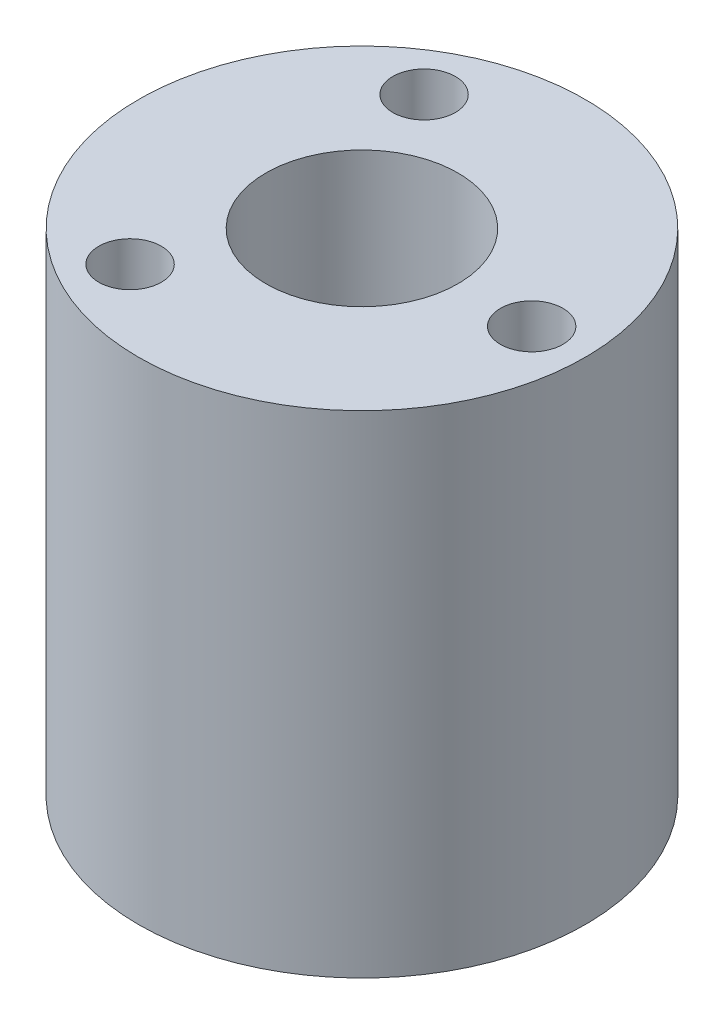
ISO-10303-21;
HEADER;
FILE_DESCRIPTION(('STEP AP214'),'2;1');
FILE_NAME('part.step','',(''),(''),'','','');
FILE_SCHEMA(('AUTOMOTIVE_DESIGN { 1 0 10303 214 1 1 1 1 }'));
ENDSEC;
DATA;
#1=APPLICATION_CONTEXT('core data for automotive mechanical design processes');
#2=APPLICATION_PROTOCOL_DEFINITION('international standard','automotive_design',2000,#1);
#3=PRODUCT_CONTEXT('',#1,'mechanical');
#4=PRODUCT('Part','Part','',(#3));
#5=PRODUCT_RELATED_PRODUCT_CATEGORY('part','',(#4));
#6=PRODUCT_DEFINITION_FORMATION('','',#4);
#7=PRODUCT_DEFINITION_CONTEXT('part definition',#1,'design');
#8=PRODUCT_DEFINITION('design','',#6,#7);
#9=PRODUCT_DEFINITION_SHAPE('','',#8);
#10=(LENGTH_UNIT() NAMED_UNIT(*) SI_UNIT(.MILLI.,.METRE.));
#11=(NAMED_UNIT(*) PLANE_ANGLE_UNIT() SI_UNIT($,.RADIAN.));
#12=(NAMED_UNIT(*) SI_UNIT($,.STERADIAN.) SOLID_ANGLE_UNIT());
#13=UNCERTAINTY_MEASURE_WITH_UNIT(LENGTH_MEASURE(1.E-05),#10,'distance_accuracy_value','');
#14=(GEOMETRIC_REPRESENTATION_CONTEXT(3) GLOBAL_UNCERTAINTY_ASSIGNED_CONTEXT((#13)) GLOBAL_UNIT_ASSIGNED_CONTEXT((#10,
#11,#12)) REPRESENTATION_CONTEXT('',''));
#15=CARTESIAN_POINT('',(0.,0.,0.));
#16=DIRECTION('',(0.,0.,1.));
#17=DIRECTION('',(1.,0.,0.));
#18=AXIS2_PLACEMENT_3D('',#15,#16,#17);
#19=CARTESIAN_POINT('',(0.,5.5,0.));
#20=DIRECTION('',(0.,-1.,0.));
#21=DIRECTION('',(0.,0.,-1.));
#22=AXIS2_PLACEMENT_3D('',#19,#20,#21);
#23=CYLINDRICAL_SURFACE('',#22,5.);
#24=CARTESIAN_POINT('',(0.,5.5,0.));
#25=DIRECTION('',(0.,1.,0.));
#26=DIRECTION('',(0.,0.,1.));
#27=AXIS2_PLACEMENT_3D('',#24,#25,#26);
#28=CIRCLE('',#27,5.);
#29=CARTESIAN_POINT('',(0.,5.5,5.));
#30=VERTEX_POINT('',#29);
#31=EDGE_CURVE('E10',#30,#30,#28,.T.);
#32=ORIENTED_EDGE('',*,*,#31,.F.);
#33=EDGE_LOOP('',(#32));
#34=FACE_BOUND('',#33,.T.);
#35=CARTESIAN_POINT('',(0.,-5.5,0.));
#36=DIRECTION('',(0.,1.,0.));
#37=DIRECTION('',(0.,0.,1.));
#38=AXIS2_PLACEMENT_3D('',#35,#36,#37);
#39=CIRCLE('',#38,5.);
#40=CARTESIAN_POINT('',(0.,-5.5,5.));
#41=VERTEX_POINT('',#40);
#42=EDGE_CURVE('E40',#41,#41,#39,.T.);
#43=ORIENTED_EDGE('',*,*,#42,.T.);
#44=EDGE_LOOP('',(#43));
#45=FACE_BOUND('',#44,.T.);
#46=ADVANCED_FACE('F37',(#34,#45),#23,.T.);
#47=CARTESIAN_POINT('',(0.,5.5,0.));
#48=DIRECTION('',(0.,1.,0.));
#49=DIRECTION('',(0.,0.,1.));
#50=AXIS2_PLACEMENT_3D('',#47,#48,#49);
#51=PLANE('',#50);
#52=CARTESIAN_POINT('',(0.,5.5,0.));
#53=DIRECTION('',(0.,1.,0.));
#54=DIRECTION('',(0.,0.,1.));
#55=AXIS2_PLACEMENT_3D('',#52,#53,#54);
#56=CIRCLE('',#55,2.15);
#57=CARTESIAN_POINT('',(0.,5.5,2.15));
#58=VERTEX_POINT('',#57);
#59=EDGE_CURVE('E85',#58,#58,#56,.T.);
#60=ORIENTED_EDGE('',*,*,#59,.F.);
#61=EDGE_LOOP('',(#60));
#62=FACE_BOUND('',#61,.T.);
#63=CARTESIAN_POINT('',(3.8,5.5,0.));
#64=DIRECTION('',(0.,1.,0.));
#65=DIRECTION('',(0.,0.,1.));
#66=AXIS2_PLACEMENT_3D('',#63,#64,#65);
#67=CIRCLE('',#66,0.699999999999999);
#68=CARTESIAN_POINT('',(3.8,5.5,0.699999999999999));
#69=VERTEX_POINT('',#68);
#70=EDGE_CURVE('E62',#69,#69,#67,.T.);
#71=ORIENTED_EDGE('',*,*,#70,.F.);
#72=EDGE_LOOP('',(#71));
#73=FACE_BOUND('',#72,.T.);
#74=CARTESIAN_POINT('',(-1.9,5.5,3.29089653438087));
#75=DIRECTION('',(0.,1.,0.));
#76=DIRECTION('',(0.,0.,1.));
#77=AXIS2_PLACEMENT_3D('',#74,#75,#76);
#78=CIRCLE('',#77,0.7);
#79=CARTESIAN_POINT('',(-1.9,5.5,3.99089653438087));
#80=VERTEX_POINT('',#79);
#81=EDGE_CURVE('E59',#80,#80,#78,.T.);
#82=ORIENTED_EDGE('',*,*,#81,.F.);
#83=EDGE_LOOP('',(#82));
#84=FACE_BOUND('',#83,.T.);
#85=CARTESIAN_POINT('',(-1.9,5.5,-3.29089653438087));
#86=DIRECTION('',(0.,1.,0.));
#87=DIRECTION('',(0.,0.,1.));
#88=AXIS2_PLACEMENT_3D('',#85,#86,#87);
#89=CIRCLE('',#88,0.7);
#90=CARTESIAN_POINT('',(-1.9,5.5,-2.59089653438087));
#91=VERTEX_POINT('',#90);
#92=EDGE_CURVE('E52',#91,#91,#89,.T.);
#93=ORIENTED_EDGE('',*,*,#92,.F.);
#94=EDGE_LOOP('',(#93));
#95=FACE_BOUND('',#94,.T.);
#96=ORIENTED_EDGE('',*,*,#31,.T.);
#97=EDGE_LOOP('',(#96));
#98=FACE_BOUND('',#97,.T.);
#99=ADVANCED_FACE('F101',(#62,#73,#84,#95,#98),#51,.T.);
#100=CARTESIAN_POINT('',(0.,-5.5,0.));
#101=DIRECTION('',(0.,1.,0.));
#102=DIRECTION('',(0.,0.,1.));
#103=AXIS2_PLACEMENT_3D('',#100,#101,#102);
#104=PLANE('',#103);
#105=CARTESIAN_POINT('',(0.,-5.5,0.));
#106=DIRECTION('',(0.,1.,0.));
#107=DIRECTION('',(0.,0.,1.));
#108=AXIS2_PLACEMENT_3D('',#105,#106,#107);
#109=CIRCLE('',#108,2.15);
#110=CARTESIAN_POINT('',(0.,-5.5,2.15));
#111=VERTEX_POINT('',#110);
#112=EDGE_CURVE('E71',#111,#111,#109,.T.);
#113=ORIENTED_EDGE('',*,*,#112,.T.);
#114=EDGE_LOOP('',(#113));
#115=FACE_BOUND('',#114,.T.);
#116=CARTESIAN_POINT('',(3.8,-5.5,0.));
#117=DIRECTION('',(0.,1.,0.));
#118=DIRECTION('',(0.,0.,1.));
#119=AXIS2_PLACEMENT_3D('',#116,#117,#118);
#120=CIRCLE('',#119,0.699999999999999);
#121=CARTESIAN_POINT('',(3.8,-5.5,0.699999999999999));
#122=VERTEX_POINT('',#121);
#123=EDGE_CURVE('E80',#122,#122,#120,.T.);
#124=ORIENTED_EDGE('',*,*,#123,.T.);
#125=EDGE_LOOP('',(#124));
#126=FACE_BOUND('',#125,.T.);
#127=CARTESIAN_POINT('',(-1.9,-5.5,3.29089653438087));
#128=DIRECTION('',(0.,1.,0.));
#129=DIRECTION('',(0.,0.,1.));
#130=AXIS2_PLACEMENT_3D('',#127,#128,#129);
#131=CIRCLE('',#130,0.7);
#132=CARTESIAN_POINT('',(-1.9,-5.5,3.99089653438087));
#133=VERTEX_POINT('',#132);
#134=EDGE_CURVE('E74',#133,#133,#131,.T.);
#135=ORIENTED_EDGE('',*,*,#134,.T.);
#136=EDGE_LOOP('',(#135));
#137=FACE_BOUND('',#136,.T.);
#138=CARTESIAN_POINT('',(-1.9,-5.5,-3.29089653438087));
#139=DIRECTION('',(0.,1.,0.));
#140=DIRECTION('',(0.,0.,1.));
#141=AXIS2_PLACEMENT_3D('',#138,#139,#140);
#142=CIRCLE('',#141,0.7);
#143=CARTESIAN_POINT('',(-1.9,-5.5,-2.59089653438087));
#144=VERTEX_POINT('',#143);
#145=EDGE_CURVE('E67',#144,#144,#142,.T.);
#146=ORIENTED_EDGE('',*,*,#145,.T.);
#147=EDGE_LOOP('',(#146));
#148=FACE_BOUND('',#147,.T.);
#149=ORIENTED_EDGE('',*,*,#42,.F.);
#150=EDGE_LOOP('',(#149));
#151=FACE_BOUND('',#150,.T.);
#152=ADVANCED_FACE('F91',(#115,#126,#137,#148,#151),#104,.F.);
#153=CARTESIAN_POINT('',(-1.9,3.,-3.29089653438087));
#154=DIRECTION('',(0.,1.,0.));
#155=DIRECTION('',(0.,0.,1.));
#156=AXIS2_PLACEMENT_3D('',#153,#154,#155);
#157=CYLINDRICAL_SURFACE('',#156,0.7);
#158=CARTESIAN_POINT('',(-1.9,3.,-3.29089653438087));
#159=DIRECTION('',(0.,1.,0.));
#160=DIRECTION('',(0.,0.,1.));
#161=AXIS2_PLACEMENT_3D('',#158,#159,#160);
#162=CIRCLE('',#161,0.7);
#163=CARTESIAN_POINT('',(-1.9,3.,-2.59089653438087));
#164=VERTEX_POINT('',#163);
#165=EDGE_CURVE('E49',#164,#164,#162,.T.);
#166=ORIENTED_EDGE('',*,*,#165,.F.);
#167=EDGE_LOOP('',(#166));
#168=FACE_BOUND('',#167,.T.);
#169=ORIENTED_EDGE('',*,*,#92,.T.);
#170=EDGE_LOOP('',(#169));
#171=FACE_BOUND('',#170,.T.);
#172=ADVANCED_FACE('F111',(#168,#171),#157,.F.);
#173=CARTESIAN_POINT('',(-1.9,3.,-3.29089653438087));
#174=DIRECTION('',(0.,1.,0.));
#175=DIRECTION('',(0.,0.,1.));
#176=AXIS2_PLACEMENT_3D('',#173,#174,#175);
#177=PLANE('',#176);
#178=ORIENTED_EDGE('',*,*,#165,.T.);
#179=EDGE_LOOP('',(#178));
#180=FACE_BOUND('',#179,.T.);
#181=ADVANCED_FACE('F113',(#180),#177,.T.);
#182=CARTESIAN_POINT('',(-1.9,3.,3.29089653438087));
#183=DIRECTION('',(0.,1.,0.));
#184=DIRECTION('',(0.,0.,1.));
#185=AXIS2_PLACEMENT_3D('',#182,#183,#184);
#186=CYLINDRICAL_SURFACE('',#185,0.7);
#187=CARTESIAN_POINT('',(-1.9,3.,3.29089653438087));
#188=DIRECTION('',(0.,1.,0.));
#189=DIRECTION('',(0.,0.,1.));
#190=AXIS2_PLACEMENT_3D('',#187,#188,#189);
#191=CIRCLE('',#190,0.7);
#192=CARTESIAN_POINT('',(-1.9,3.,3.99089653438087));
#193=VERTEX_POINT('',#192);
#194=EDGE_CURVE('E56',#193,#193,#191,.T.);
#195=ORIENTED_EDGE('',*,*,#194,.F.);
#196=EDGE_LOOP('',(#195));
#197=FACE_BOUND('',#196,.T.);
#198=ORIENTED_EDGE('',*,*,#81,.T.);
#199=EDGE_LOOP('',(#198));
#200=FACE_BOUND('',#199,.T.);
#201=ADVANCED_FACE('F120',(#197,#200),#186,.F.);
#202=CARTESIAN_POINT('',(-1.9,3.,3.29089653438087));
#203=DIRECTION('',(0.,1.,0.));
#204=DIRECTION('',(0.,0.,1.));
#205=AXIS2_PLACEMENT_3D('',#202,#203,#204);
#206=PLANE('',#205);
#207=ORIENTED_EDGE('',*,*,#194,.T.);
#208=EDGE_LOOP('',(#207));
#209=FACE_BOUND('',#208,.T.);
#210=ADVANCED_FACE('F165',(#209),#206,.T.);
#211=CARTESIAN_POINT('',(3.8,3.,0.));
#212=DIRECTION('',(0.,1.,0.));
#213=DIRECTION('',(0.,0.,1.));
#214=AXIS2_PLACEMENT_3D('',#211,#212,#213);
#215=CYLINDRICAL_SURFACE('',#214,0.699999999999999);
#216=CARTESIAN_POINT('',(3.8,3.,0.));
#217=DIRECTION('',(0.,1.,0.));
#218=DIRECTION('',(0.,0.,1.));
#219=AXIS2_PLACEMENT_3D('',#216,#217,#218);
#220=CIRCLE('',#219,0.699999999999999);
#221=CARTESIAN_POINT('',(3.8,3.,0.699999999999999));
#222=VERTEX_POINT('',#221);
#223=EDGE_CURVE('E47',#222,#222,#220,.T.);
#224=ORIENTED_EDGE('',*,*,#223,.F.);
#225=EDGE_LOOP('',(#224));
#226=FACE_BOUND('',#225,.T.);
#227=ORIENTED_EDGE('',*,*,#70,.T.);
#228=EDGE_LOOP('',(#227));
#229=FACE_BOUND('',#228,.T.);
#230=ADVANCED_FACE('F175',(#226,#229),#215,.F.);
#231=CARTESIAN_POINT('',(3.8,3.,0.));
#232=DIRECTION('',(0.,1.,0.));
#233=DIRECTION('',(0.,0.,1.));
#234=AXIS2_PLACEMENT_3D('',#231,#232,#233);
#235=PLANE('',#234);
#236=ORIENTED_EDGE('',*,*,#223,.T.);
#237=EDGE_LOOP('',(#236));
#238=FACE_BOUND('',#237,.T.);
#239=ADVANCED_FACE('F184',(#238),#235,.T.);
#240=CARTESIAN_POINT('',(-1.9,-3.,-3.29089653438087));
#241=DIRECTION('',(0.,-1.,0.));
#242=DIRECTION('',(0.,0.,-1.));
#243=AXIS2_PLACEMENT_3D('',#240,#241,#242);
#244=CYLINDRICAL_SURFACE('',#243,0.7);
#245=CARTESIAN_POINT('',(-1.9,-3.,-3.29089653438087));
#246=DIRECTION('',(0.,1.,0.));
#247=DIRECTION('',(0.,0.,1.));
#248=AXIS2_PLACEMENT_3D('',#245,#246,#247);
#249=CIRCLE('',#248,0.7);
#250=CARTESIAN_POINT('',(-1.9,-3.,-2.59089653438087));
#251=VERTEX_POINT('',#250);
#252=EDGE_CURVE('E70',#251,#251,#249,.T.);
#253=ORIENTED_EDGE('',*,*,#252,.T.);
#254=EDGE_LOOP('',(#253));
#255=FACE_BOUND('',#254,.T.);
#256=ORIENTED_EDGE('',*,*,#145,.F.);
#257=EDGE_LOOP('',(#256));
#258=FACE_BOUND('',#257,.T.);
#259=ADVANCED_FACE('F194',(#255,#258),#244,.F.);
#260=CARTESIAN_POINT('',(-1.9,-3.,-3.29089653438087));
#261=DIRECTION('',(0.,-1.,0.));
#262=DIRECTION('',(0.,0.,1.));
#263=AXIS2_PLACEMENT_3D('',#260,#261,#262);
#264=PLANE('',#263);
#265=ORIENTED_EDGE('',*,*,#252,.F.);
#266=EDGE_LOOP('',(#265));
#267=FACE_BOUND('',#266,.T.);
#268=ADVANCED_FACE('F204',(#267),#264,.T.);
#269=CARTESIAN_POINT('',(-1.9,-3.,3.29089653438087));
#270=DIRECTION('',(0.,-1.,0.));
#271=DIRECTION('',(0.,0.,-1.));
#272=AXIS2_PLACEMENT_3D('',#269,#270,#271);
#273=CYLINDRICAL_SURFACE('',#272,0.7);
#274=CARTESIAN_POINT('',(-1.9,-3.,3.29089653438087));
#275=DIRECTION('',(0.,1.,0.));
#276=DIRECTION('',(0.,0.,1.));
#277=AXIS2_PLACEMENT_3D('',#274,#275,#276);
#278=CIRCLE('',#277,0.7);
#279=CARTESIAN_POINT('',(-1.9,-3.,3.99089653438087));
#280=VERTEX_POINT('',#279);
#281=EDGE_CURVE('E77',#280,#280,#278,.T.);
#282=ORIENTED_EDGE('',*,*,#281,.T.);
#283=EDGE_LOOP('',(#282));
#284=FACE_BOUND('',#283,.T.);
#285=ORIENTED_EDGE('',*,*,#134,.F.);
#286=EDGE_LOOP('',(#285));
#287=FACE_BOUND('',#286,.T.);
#288=ADVANCED_FACE('F214',(#284,#287),#273,.F.);
#289=CARTESIAN_POINT('',(-1.9,-3.,3.29089653438087));
#290=DIRECTION('',(0.,-1.,0.));
#291=DIRECTION('',(0.,0.,1.));
#292=AXIS2_PLACEMENT_3D('',#289,#290,#291);
#293=PLANE('',#292);
#294=ORIENTED_EDGE('',*,*,#281,.F.);
#295=EDGE_LOOP('',(#294));
#296=FACE_BOUND('',#295,.T.);
#297=ADVANCED_FACE('F224',(#296),#293,.T.);
#298=CARTESIAN_POINT('',(3.8,-3.,0.));
#299=DIRECTION('',(0.,-1.,0.));
#300=DIRECTION('',(0.,0.,-1.));
#301=AXIS2_PLACEMENT_3D('',#298,#299,#300);
#302=CYLINDRICAL_SURFACE('',#301,0.699999999999999);
#303=CARTESIAN_POINT('',(3.8,-3.,0.));
#304=DIRECTION('',(0.,1.,0.));
#305=DIRECTION('',(0.,0.,1.));
#306=AXIS2_PLACEMENT_3D('',#303,#304,#305);
#307=CIRCLE('',#306,0.699999999999999);
#308=CARTESIAN_POINT('',(3.8,-3.,0.699999999999999));
#309=VERTEX_POINT('',#308);
#310=EDGE_CURVE('E53',#309,#309,#307,.T.);
#311=ORIENTED_EDGE('',*,*,#310,.T.);
#312=EDGE_LOOP('',(#311));
#313=FACE_BOUND('',#312,.T.);
#314=ORIENTED_EDGE('',*,*,#123,.F.);
#315=EDGE_LOOP('',(#314));
#316=FACE_BOUND('',#315,.T.);
#317=ADVANCED_FACE('F234',(#313,#316),#302,.F.);
#318=CARTESIAN_POINT('',(3.8,-3.,0.));
#319=DIRECTION('',(0.,-1.,0.));
#320=DIRECTION('',(0.,0.,1.));
#321=AXIS2_PLACEMENT_3D('',#318,#319,#320);
#322=PLANE('',#321);
#323=ORIENTED_EDGE('',*,*,#310,.F.);
#324=EDGE_LOOP('',(#323));
#325=FACE_BOUND('',#324,.T.);
#326=ADVANCED_FACE('F97',(#325),#322,.T.);
#327=CARTESIAN_POINT('',(0.,-5.5,0.));
#328=DIRECTION('',(0.,1.,0.));
#329=DIRECTION('',(0.,0.,1.));
#330=AXIS2_PLACEMENT_3D('',#327,#328,#329);
#331=CYLINDRICAL_SURFACE('',#330,2.15);
#332=ORIENTED_EDGE('',*,*,#112,.F.);
#333=EDGE_LOOP('',(#332));
#334=FACE_BOUND('',#333,.T.);
#335=ORIENTED_EDGE('',*,*,#59,.T.);
#336=EDGE_LOOP('',(#335));
#337=FACE_BOUND('',#336,.T.);
#338=ADVANCED_FACE('F94',(#334,#337),#331,.F.);
#339=CLOSED_SHELL('',(#46,#99,#152,#172,#181,#201,#210,#230,#239,#259,#268,#288,#297,#317,#326,#338));
#340=MANIFOLD_SOLID_BREP('B2',#339);
#341=ADVANCED_BREP_SHAPE_REPRESENTATION('',(#18,#340),#14);
#342=SHAPE_DEFINITION_REPRESENTATION(#9,#341);
ENDSEC;
END-ISO-10303-21;
